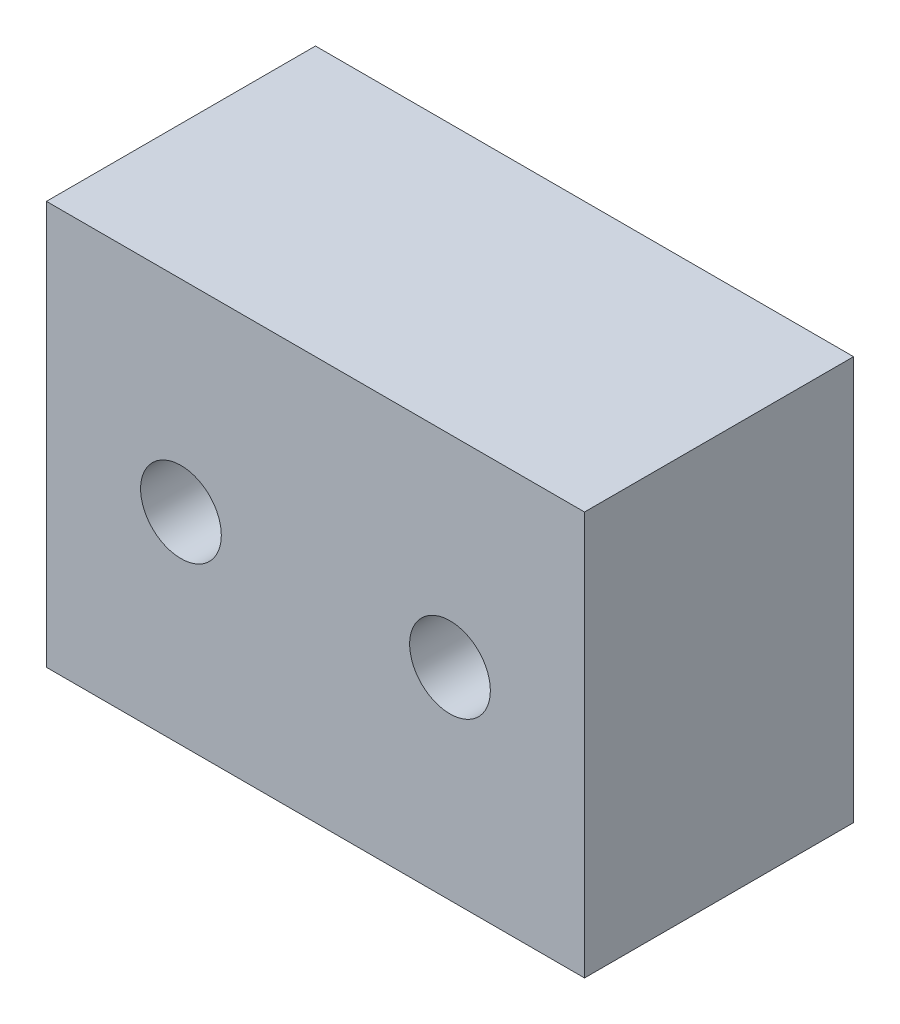
ISO-10303-21;
HEADER;
FILE_DESCRIPTION(('STEP AP214'),'2;1');
FILE_NAME('part.step','',(''),(''),'','','');
FILE_SCHEMA(('AUTOMOTIVE_DESIGN { 1 0 10303 214 1 1 1 1 }'));
ENDSEC;
DATA;
#1=APPLICATION_CONTEXT('core data for automotive mechanical design processes');
#2=APPLICATION_PROTOCOL_DEFINITION('international standard','automotive_design',2000,#1);
#3=PRODUCT_CONTEXT('',#1,'mechanical');
#4=PRODUCT('Part','Part','',(#3));
#5=PRODUCT_RELATED_PRODUCT_CATEGORY('part','',(#4));
#6=PRODUCT_DEFINITION_FORMATION('','',#4);
#7=PRODUCT_DEFINITION_CONTEXT('part definition',#1,'design');
#8=PRODUCT_DEFINITION('design','',#6,#7);
#9=PRODUCT_DEFINITION_SHAPE('','',#8);
#10=(LENGTH_UNIT() NAMED_UNIT(*) SI_UNIT(.MILLI.,.METRE.));
#11=(NAMED_UNIT(*) PLANE_ANGLE_UNIT() SI_UNIT($,.RADIAN.));
#12=(NAMED_UNIT(*) SI_UNIT($,.STERADIAN.) SOLID_ANGLE_UNIT());
#13=UNCERTAINTY_MEASURE_WITH_UNIT(LENGTH_MEASURE(1.E-05),#10,'distance_accuracy_value','');
#14=(GEOMETRIC_REPRESENTATION_CONTEXT(3) GLOBAL_UNCERTAINTY_ASSIGNED_CONTEXT((#13)) GLOBAL_UNIT_ASSIGNED_CONTEXT((#10,
#11,#12)) REPRESENTATION_CONTEXT('',''));
#15=CARTESIAN_POINT('',(0.,0.,0.));
#16=DIRECTION('',(0.,0.,1.));
#17=DIRECTION('',(1.,0.,0.));
#18=AXIS2_PLACEMENT_3D('',#15,#16,#17);
#19=CARTESIAN_POINT('',(0.,30.,20.));
#20=DIRECTION('',(1.,0.,0.));
#21=DIRECTION('',(0.,0.,-1.));
#22=AXIS2_PLACEMENT_3D('',#19,#20,#21);
#23=PLANE('',#22);
#24=DIRECTION('',(0.,-1.,0.));
#25=VECTOR('',#24,1.);
#26=CARTESIAN_POINT('',(0.,30.,0.));
#27=LINE('',#26,#25);
#28=CARTESIAN_POINT('',(0.,30.,0.));
#29=VERTEX_POINT('',#28);
#30=CARTESIAN_POINT('',(0.,0.,0.));
#31=VERTEX_POINT('',#30);
#32=EDGE_CURVE('E106',#29,#31,#27,.T.);
#33=ORIENTED_EDGE('',*,*,#32,.T.);
#34=DIRECTION('',(0.,0.,-1.));
#35=VECTOR('',#34,1.);
#36=CARTESIAN_POINT('',(0.,0.,20.));
#37=LINE('',#36,#35);
#38=CARTESIAN_POINT('',(0.,0.,20.));
#39=VERTEX_POINT('',#38);
#40=EDGE_CURVE('E11',#39,#31,#37,.T.);
#41=ORIENTED_EDGE('',*,*,#40,.F.);
#42=DIRECTION('',(0.,-1.,0.));
#43=VECTOR('',#42,1.);
#44=CARTESIAN_POINT('',(0.,30.,20.));
#45=LINE('',#44,#43);
#46=CARTESIAN_POINT('',(0.,30.,20.));
#47=VERTEX_POINT('',#46);
#48=EDGE_CURVE('E94',#47,#39,#45,.T.);
#49=ORIENTED_EDGE('',*,*,#48,.F.);
#50=DIRECTION('',(0.,0.,-1.));
#51=VECTOR('',#50,1.);
#52=CARTESIAN_POINT('',(0.,30.,20.));
#53=LINE('',#52,#51);
#54=EDGE_CURVE('E102',#47,#29,#53,.T.);
#55=ORIENTED_EDGE('',*,*,#54,.T.);
#56=EDGE_LOOP('',(#33,#41,#49,#55));
#57=FACE_BOUND('',#56,.T.);
#58=ADVANCED_FACE('F43',(#57),#23,.F.);
#59=CARTESIAN_POINT('',(0.,0.,20.));
#60=DIRECTION('',(0.,1.,0.));
#61=DIRECTION('',(0.,0.,1.));
#62=AXIS2_PLACEMENT_3D('',#59,#60,#61);
#63=PLANE('',#62);
#64=DIRECTION('',(1.,0.,0.));
#65=VECTOR('',#64,1.);
#66=CARTESIAN_POINT('',(0.,0.,0.));
#67=LINE('',#66,#65);
#68=CARTESIAN_POINT('',(40.,0.,0.));
#69=VERTEX_POINT('',#68);
#70=EDGE_CURVE('E98',#31,#69,#67,.T.);
#71=ORIENTED_EDGE('',*,*,#70,.T.);
#72=DIRECTION('',(0.,0.,-1.));
#73=VECTOR('',#72,1.);
#74=CARTESIAN_POINT('',(40.,0.,20.));
#75=LINE('',#74,#73);
#76=CARTESIAN_POINT('',(40.,0.,20.));
#77=VERTEX_POINT('',#76);
#78=EDGE_CURVE('E51',#77,#69,#75,.T.);
#79=ORIENTED_EDGE('',*,*,#78,.F.);
#80=DIRECTION('',(1.,0.,0.));
#81=VECTOR('',#80,1.);
#82=CARTESIAN_POINT('',(0.,0.,20.));
#83=LINE('',#82,#81);
#84=EDGE_CURVE('E89',#39,#77,#83,.T.);
#85=ORIENTED_EDGE('',*,*,#84,.F.);
#86=ORIENTED_EDGE('',*,*,#40,.T.);
#87=EDGE_LOOP('',(#71,#79,#85,#86));
#88=FACE_BOUND('',#87,.T.);
#89=ADVANCED_FACE('F97',(#88),#63,.F.);
#90=CARTESIAN_POINT('',(40.,0.,20.));
#91=DIRECTION('',(-1.,0.,0.));
#92=DIRECTION('',(0.,0.,1.));
#93=AXIS2_PLACEMENT_3D('',#90,#91,#92);
#94=PLANE('',#93);
#95=DIRECTION('',(0.,1.,0.));
#96=VECTOR('',#95,1.);
#97=CARTESIAN_POINT('',(40.,0.,0.));
#98=LINE('',#97,#96);
#99=CARTESIAN_POINT('',(40.,30.,0.));
#100=VERTEX_POINT('',#99);
#101=EDGE_CURVE('E76',#69,#100,#98,.T.);
#102=ORIENTED_EDGE('',*,*,#101,.T.);
#103=DIRECTION('',(0.,0.,-1.));
#104=VECTOR('',#103,1.);
#105=CARTESIAN_POINT('',(40.,30.,20.));
#106=LINE('',#105,#104);
#107=CARTESIAN_POINT('',(40.,30.,20.));
#108=VERTEX_POINT('',#107);
#109=EDGE_CURVE('E99',#108,#100,#106,.T.);
#110=ORIENTED_EDGE('',*,*,#109,.F.);
#111=DIRECTION('',(0.,1.,0.));
#112=VECTOR('',#111,1.);
#113=CARTESIAN_POINT('',(40.,0.,20.));
#114=LINE('',#113,#112);
#115=EDGE_CURVE('E92',#77,#108,#114,.T.);
#116=ORIENTED_EDGE('',*,*,#115,.F.);
#117=ORIENTED_EDGE('',*,*,#78,.T.);
#118=EDGE_LOOP('',(#102,#110,#116,#117));
#119=FACE_BOUND('',#118,.T.);
#120=ADVANCED_FACE('F100',(#119),#94,.F.);
#121=CARTESIAN_POINT('',(40.,30.,20.));
#122=DIRECTION('',(0.,-1.,0.));
#123=DIRECTION('',(0.,0.,-1.));
#124=AXIS2_PLACEMENT_3D('',#121,#122,#123);
#125=PLANE('',#124);
#126=DIRECTION('',(-1.,0.,0.));
#127=VECTOR('',#126,1.);
#128=CARTESIAN_POINT('',(40.,30.,0.));
#129=LINE('',#128,#127);
#130=EDGE_CURVE('E82',#100,#29,#129,.T.);
#131=ORIENTED_EDGE('',*,*,#130,.T.);
#132=ORIENTED_EDGE('',*,*,#54,.F.);
#133=DIRECTION('',(-1.,0.,0.));
#134=VECTOR('',#133,1.);
#135=CARTESIAN_POINT('',(40.,30.,20.));
#136=LINE('',#135,#134);
#137=EDGE_CURVE('E59',#108,#47,#136,.T.);
#138=ORIENTED_EDGE('',*,*,#137,.F.);
#139=ORIENTED_EDGE('',*,*,#109,.T.);
#140=EDGE_LOOP('',(#131,#132,#138,#139));
#141=FACE_BOUND('',#140,.T.);
#142=ADVANCED_FACE('F114',(#141),#125,.F.);
#143=CARTESIAN_POINT('',(0.,0.,20.));
#144=DIRECTION('',(0.,0.,1.));
#145=DIRECTION('',(1.,0.,0.));
#146=AXIS2_PLACEMENT_3D('',#143,#144,#145);
#147=PLANE('',#146);
#148=CARTESIAN_POINT('',(10.,15.,20.));
#149=DIRECTION('',(0.,0.,1.));
#150=DIRECTION('',(1.,0.,0.));
#151=AXIS2_PLACEMENT_3D('',#148,#149,#150);
#152=CIRCLE('',#151,3.);
#153=CARTESIAN_POINT('',(13.,15.,20.));
#154=VERTEX_POINT('',#153);
#155=EDGE_CURVE('E126',#154,#154,#152,.T.);
#156=ORIENTED_EDGE('',*,*,#155,.F.);
#157=EDGE_LOOP('',(#156));
#158=FACE_BOUND('',#157,.T.);
#159=CARTESIAN_POINT('',(30.,15.,20.));
#160=DIRECTION('',(0.,0.,1.));
#161=DIRECTION('',(1.,0.,0.));
#162=AXIS2_PLACEMENT_3D('',#159,#160,#161);
#163=CIRCLE('',#162,3.);
#164=CARTESIAN_POINT('',(33.,15.,20.));
#165=VERTEX_POINT('',#164);
#166=EDGE_CURVE('E123',#165,#165,#163,.T.);
#167=ORIENTED_EDGE('',*,*,#166,.F.);
#168=EDGE_LOOP('',(#167));
#169=FACE_BOUND('',#168,.T.);
#170=ORIENTED_EDGE('',*,*,#48,.T.);
#171=ORIENTED_EDGE('',*,*,#84,.T.);
#172=ORIENTED_EDGE('',*,*,#115,.T.);
#173=ORIENTED_EDGE('',*,*,#137,.T.);
#174=EDGE_LOOP('',(#170,#171,#172,#173));
#175=FACE_BOUND('',#174,.T.);
#176=ADVANCED_FACE('F90',(#158,#169,#175),#147,.T.);
#177=CARTESIAN_POINT('',(0.,0.,0.));
#178=DIRECTION('',(0.,0.,1.));
#179=DIRECTION('',(1.,0.,0.));
#180=AXIS2_PLACEMENT_3D('',#177,#178,#179);
#181=PLANE('',#180);
#182=CARTESIAN_POINT('',(10.,15.,0.));
#183=DIRECTION('',(0.,0.,1.));
#184=DIRECTION('',(1.,0.,0.));
#185=AXIS2_PLACEMENT_3D('',#182,#183,#184);
#186=CIRCLE('',#185,3.);
#187=CARTESIAN_POINT('',(13.,15.,0.));
#188=VERTEX_POINT('',#187);
#189=EDGE_CURVE('E109',#188,#188,#186,.T.);
#190=ORIENTED_EDGE('',*,*,#189,.T.);
#191=EDGE_LOOP('',(#190));
#192=FACE_BOUND('',#191,.T.);
#193=CARTESIAN_POINT('',(30.,15.,0.));
#194=DIRECTION('',(0.,0.,1.));
#195=DIRECTION('',(1.,0.,0.));
#196=AXIS2_PLACEMENT_3D('',#193,#194,#195);
#197=CIRCLE('',#196,3.);
#198=CARTESIAN_POINT('',(33.,15.,0.));
#199=VERTEX_POINT('',#198);
#200=EDGE_CURVE('E120',#199,#199,#197,.T.);
#201=ORIENTED_EDGE('',*,*,#200,.T.);
#202=EDGE_LOOP('',(#201));
#203=FACE_BOUND('',#202,.T.);
#204=ORIENTED_EDGE('',*,*,#32,.F.);
#205=ORIENTED_EDGE('',*,*,#130,.F.);
#206=ORIENTED_EDGE('',*,*,#101,.F.);
#207=ORIENTED_EDGE('',*,*,#70,.F.);
#208=EDGE_LOOP('',(#204,#205,#206,#207));
#209=FACE_BOUND('',#208,.T.);
#210=ADVANCED_FACE('F117',(#192,#203,#209),#181,.F.);
#211=CARTESIAN_POINT('',(30.,15.,0.));
#212=DIRECTION('',(0.,0.,1.));
#213=DIRECTION('',(1.,0.,0.));
#214=AXIS2_PLACEMENT_3D('',#211,#212,#213);
#215=CYLINDRICAL_SURFACE('',#214,3.);
#216=ORIENTED_EDGE('',*,*,#200,.F.);
#217=EDGE_LOOP('',(#216));
#218=FACE_BOUND('',#217,.T.);
#219=ORIENTED_EDGE('',*,*,#166,.T.);
#220=EDGE_LOOP('',(#219));
#221=FACE_BOUND('',#220,.T.);
#222=ADVANCED_FACE('F137',(#218,#221),#215,.F.);
#223=CARTESIAN_POINT('',(10.,15.,0.));
#224=DIRECTION('',(0.,0.,1.));
#225=DIRECTION('',(1.,0.,0.));
#226=AXIS2_PLACEMENT_3D('',#223,#224,#225);
#227=CYLINDRICAL_SURFACE('',#226,3.);
#228=ORIENTED_EDGE('',*,*,#189,.F.);
#229=EDGE_LOOP('',(#228));
#230=FACE_BOUND('',#229,.T.);
#231=ORIENTED_EDGE('',*,*,#155,.T.);
#232=EDGE_LOOP('',(#231));
#233=FACE_BOUND('',#232,.T.);
#234=ADVANCED_FACE('F134',(#230,#233),#227,.F.);
#235=CLOSED_SHELL('',(#58,#89,#120,#142,#176,#210,#222,#234));
#236=MANIFOLD_SOLID_BREP('B2',#235);
#237=ADVANCED_BREP_SHAPE_REPRESENTATION('',(#18,#236),#14);
#238=SHAPE_DEFINITION_REPRESENTATION(#9,#237);
ENDSEC;
END-ISO-10303-21;
